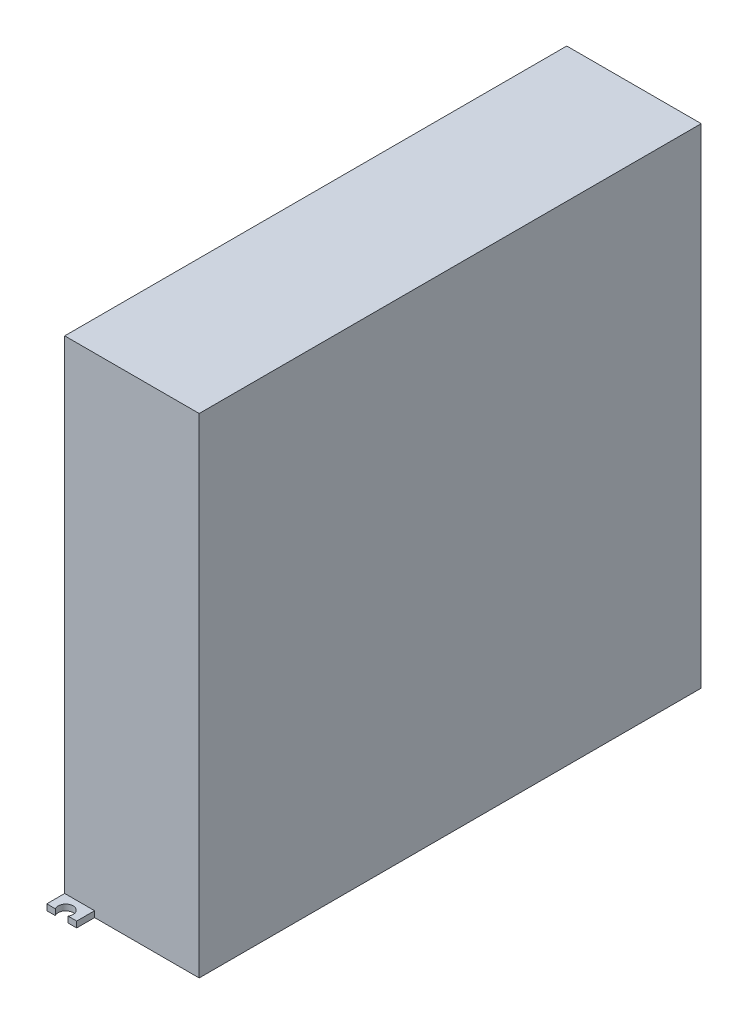
ISO-10303-21;
HEADER;
FILE_DESCRIPTION(('STEP AP214'),'2;1');
FILE_NAME('part.step','',(''),(''),'','','');
FILE_SCHEMA(('AUTOMOTIVE_DESIGN { 1 0 10303 214 1 1 1 1 }'));
ENDSEC;
DATA;
#1=APPLICATION_CONTEXT('core data for automotive mechanical design processes');
#2=APPLICATION_PROTOCOL_DEFINITION('international standard','automotive_design',2000,#1);
#3=PRODUCT_CONTEXT('',#1,'mechanical');
#4=PRODUCT('Part','Part','',(#3));
#5=PRODUCT_RELATED_PRODUCT_CATEGORY('part','',(#4));
#6=PRODUCT_DEFINITION_FORMATION('','',#4);
#7=PRODUCT_DEFINITION_CONTEXT('part definition',#1,'design');
#8=PRODUCT_DEFINITION('design','',#6,#7);
#9=PRODUCT_DEFINITION_SHAPE('','',#8);
#10=(LENGTH_UNIT() NAMED_UNIT(*) SI_UNIT(.MILLI.,.METRE.));
#11=(NAMED_UNIT(*) PLANE_ANGLE_UNIT() SI_UNIT($,.RADIAN.));
#12=(NAMED_UNIT(*) SI_UNIT($,.STERADIAN.) SOLID_ANGLE_UNIT());
#13=UNCERTAINTY_MEASURE_WITH_UNIT(LENGTH_MEASURE(1.E-05),#10,'distance_accuracy_value','');
#14=(GEOMETRIC_REPRESENTATION_CONTEXT(3) GLOBAL_UNCERTAINTY_ASSIGNED_CONTEXT((#13)) GLOBAL_UNIT_ASSIGNED_CONTEXT((#10,
#11,#12)) REPRESENTATION_CONTEXT('',''));
#15=CARTESIAN_POINT('',(0.,0.,0.));
#16=DIRECTION('',(0.,0.,1.));
#17=DIRECTION('',(1.,0.,0.));
#18=AXIS2_PLACEMENT_3D('',#15,#16,#17);
#19=CARTESIAN_POINT('',(0.,2.,174.));
#20=DIRECTION('',(0.,0.,1.));
#21=DIRECTION('',(1.,0.,0.));
#22=AXIS2_PLACEMENT_3D('',#19,#20,#21);
#23=PLANE('',#22);
#24=DIRECTION('',(0.,-1.,0.));
#25=VECTOR('',#24,1.);
#26=CARTESIAN_POINT('',(7.12165179648103,0.,174.));
#27=LINE('',#26,#25);
#28=CARTESIAN_POINT('',(7.12165179648104,0.0209774907794294,174.));
#29=VERTEX_POINT('',#28);
#30=CARTESIAN_POINT('',(7.12165179648103,2.,174.));
#31=VERTEX_POINT('',#30);
#32=EDGE_CURVE('E11',#29,#31,#27,.F.);
#33=ORIENTED_EDGE('',*,*,#32,.F.);
#34=CARTESIAN_POINT('',(10.5552261417755,-2.67290198077238,174.));
#35=CARTESIAN_POINT('',(10.4252272117758,-2.5667904441189,174.));
#36=CARTESIAN_POINT('',(10.2951354911997,-2.46079224657259,174.));
#37=CARTESIAN_POINT('',(10.0347083469683,-2.24909284339983,174.));
#38=CARTESIAN_POINT('',(9.90437292070766,-2.14339164097902,174.));
#39=CARTESIAN_POINT('',(9.64333961160713,-1.93230753844873,174.));
#40=CARTESIAN_POINT('',(9.5126415833817,-1.8269248180296,174.));
#41=CARTESIAN_POINT('',(9.25086470512443,-1.61663470287384,174.));
#42=CARTESIAN_POINT('',(9.1197858573177,-1.51172730536906,174.));
#43=CARTESIAN_POINT('',(8.85629401035401,-1.30186440652924,174.));
#44=CARTESIAN_POINT('',(8.72387783905919,-1.19691288467479,174.));
#45=CARTESIAN_POINT('',(8.45838007459504,-0.987855192045168,174.));
#46=CARTESIAN_POINT('',(8.32529848530474,-0.883749016351335,174.));
#47=CARTESIAN_POINT('',(8.05825311570482,-0.67673377103116,174.));
#48=CARTESIAN_POINT('',(7.92428953625225,-0.57382444267166,174.));
#49=CARTESIAN_POINT('',(7.65508233299974,-0.369696535439789,174.));
#50=CARTESIAN_POINT('',(7.51983875822405,-0.268477892220888,174.));
#51=CARTESIAN_POINT('',(7.28990134983008,-0.0997658160887914,174.));
#52=CARTESIAN_POINT('',(7.19570665703793,-0.0315934175537622,174.));
#53=CARTESIAN_POINT('',(7.00609149285969,0.103064149299188,174.));
#54=CARTESIAN_POINT('',(6.91067083927878,0.169549062360663,174.));
#55=CARTESIAN_POINT('',(6.71812745140789,0.300117653753453,174.));
#56=CARTESIAN_POINT('',(6.6210039281001,0.364200173348755,174.));
#57=CARTESIAN_POINT('',(6.42445814883,0.488735070948628,174.));
#58=CARTESIAN_POINT('',(6.32503656071694,0.549188485697892,174.));
#59=CARTESIAN_POINT('',(6.16568877101694,0.640002278461642,174.));
#60=CARTESIAN_POINT('',(6.10685475513554,0.672270739793827,174.));
#61=CARTESIAN_POINT('',(5.98786594588955,0.734264996376863,174.));
#62=CARTESIAN_POINT('',(5.92771145992594,0.76399137569006,174.));
#63=CARTESIAN_POINT('',(5.80589347383142,0.820027494871496,174.));
#64=CARTESIAN_POINT('',(5.74423168349132,0.846340910264383,174.));
#65=CARTESIAN_POINT('',(5.61915339455988,0.894428629931202,174.));
#66=CARTESIAN_POINT('',(5.55573770675432,0.916204993125566,174.));
#67=CARTESIAN_POINT('',(5.44511309196672,0.948540325305285,174.));
#68=CARTESIAN_POINT('',(5.39832609673766,0.960533496370555,174.));
#69=CARTESIAN_POINT('',(5.30396797029418,0.980852393511029,174.));
#70=CARTESIAN_POINT('',(5.25639717223527,0.989179638093513,174.));
#71=CARTESIAN_POINT('',(5.16089995057854,1.00166177049172,174.));
#72=CARTESIAN_POINT('',(5.1129757845144,1.00583362390967,174.));
#73=CARTESIAN_POINT('',(5.01694388457051,1.00978672020062,174.));
#74=CARTESIAN_POINT('',(4.96883615479627,1.00956806070139,174.));
#75=CARTESIAN_POINT('',(4.87287786660223,1.00475729911779,174.));
#76=CARTESIAN_POINT('',(4.82502715301268,1.00016822916666,174.));
#77=CARTESIAN_POINT('',(4.72989009122344,0.98692149363303,174.));
#78=CARTESIAN_POINT('',(4.68260389783293,0.978262737152801,174.));
#79=CARTESIAN_POINT('',(4.58860135890327,0.957315692894847,174.));
#80=CARTESIAN_POINT('',(4.54188915440346,0.945009103229031,174.));
#81=CARTESIAN_POINT('',(4.4493986171297,0.917351076734052,174.));
#82=CARTESIAN_POINT('',(4.40362011228103,0.902000206641039,174.));
#83=CARTESIAN_POINT('',(4.27207564447061,0.853818982047751,174.));
#84=CARTESIAN_POINT('',(4.1875119678578,0.817717753379313,174.));
#85=CARTESIAN_POINT('',(4.02120452647289,0.739462646884228,174.));
#86=CARTESIAN_POINT('',(3.93946437544267,0.697301344821698,174.));
#87=CARTESIAN_POINT('',(3.77791224767916,0.608732990259849,174.));
#88=CARTESIAN_POINT('',(3.69810935618469,0.562309531509842,174.));
#89=CARTESIAN_POINT('',(3.54027513498129,0.466654959926658,174.));
#90=CARTESIAN_POINT('',(3.46224296831253,0.417425213873388,174.));
#91=CARTESIAN_POINT('',(3.30630530315826,0.316181117478604,174.));
#92=CARTESIAN_POINT('',(3.22842012684065,0.264135627299528,174.));
#93=CARTESIAN_POINT('',(3.07368279238242,0.158521279368328,174.));
#94=CARTESIAN_POINT('',(2.99683073899716,0.104952268826484,174.));
#95=CARTESIAN_POINT('',(2.76784832582868,-0.0571687839740931,174.));
#96=CARTESIAN_POINT('',(2.61690393934954,-0.167392665219842,174.));
#97=CARTESIAN_POINT('',(2.3350327798177,-0.377081994039548,174.));
#98=CARTESIAN_POINT('',(2.2038809546209,-0.476247878832376,174.));
#99=CARTESIAN_POINT('',(1.94265586632526,-0.675997697046022,174.));
#100=CARTESIAN_POINT('',(1.81258263562643,-0.776581672821701,174.));
#101=CARTESIAN_POINT('',(1.55308962177221,-0.978845022110098,174.));
#102=CARTESIAN_POINT('',(1.42367059526439,-1.08052536393412,174.));
#103=CARTESIAN_POINT('',(1.16541461688171,-1.28462306144489,174.));
#104=CARTESIAN_POINT('',(1.03657766753501,-1.38704042032776,174.));
#105=CARTESIAN_POINT('',(0.662737840698865,-1.68552384381983,174.));
#106=CARTESIAN_POINT('',(0.418312554312423,-1.88231297870572,174.));
#107=CARTESIAN_POINT('',(0.0525627731177986,-2.17830941130251,174.));
#108=CARTESIAN_POINT('',(-0.0691371829845904,-2.27705423994857,174.));
#109=CARTESIAN_POINT('',(-0.312327950156759,-2.47479923860023,174.));
#110=CARTESIAN_POINT('',(-0.433818762824118,-2.57379940664081,174.));
#111=CARTESIAN_POINT('',(-0.555226141775491,-2.67290198077238,174.));
#112=B_SPLINE_CURVE_WITH_KNOTS('',3,(#34,#35,#36,#37,#38,#39,#40,#41,#42,#43,#44,#45,#46,#47,
#48,#49,#50,#51,#52,#53,#54,#55,#56,#57,#58,#59,#60,#61,#62,#63,#64,#65,#66,#67,#68,#69,#70,#71,
#72,#73,#74,#75,#76,#77,#78,#79,#80,#81,#82,#83,#84,#85,#86,#87,#88,#89,#90,#91,#92,#93,#94,#95,
#96,#97,#98,#99,#100,#101,#102,#103,#104,#105,#106,#107,#108,#109,#110,#111),.UNSPECIFIED.,.F.,
.F.,(4,2,2,2,2,2,2,2,2,2,2,2,2,2,2,2,2,2,2,2,2,2,2,2,2,2,2,2,2,2,2,2,2,2,2,2,2,2,4),(0.,
0.503422964028827,1.00685134106492,1.51052441922454,2.01419456033998,2.52108442939646,
3.02797134698476,3.53474656956601,4.04150246041526,4.39031817433377,4.73918634093396,
5.08822066566091,5.43715480078417,5.63841687005615,5.83963257292453,6.04062974873347,
6.24153551212002,6.38631243003613,6.53102932161605,6.67515291200668,6.81927329765791,
6.96329376726834,7.10735286424805,7.25214733356632,7.39691487259388,7.67234899581727,
7.94812347770937,8.22500796210096,8.501758725565,8.78275669993661,9.06378295490012,
9.62443914150388,10.1176970650645,10.6109697523589,11.1047211415359,11.5984746731807,
12.5398630439243,13.0100254491303,13.480184246839),.UNSPECIFIED.);
#113=CARTESIAN_POINT('',(7.15105354315304,0.,174.));
#114=VERTEX_POINT('',#113);
#115=EDGE_CURVE('E43',#114,#29,#112,.T.);
#116=ORIENTED_EDGE('',*,*,#115,.F.);
#117=DIRECTION('',(-1.,0.,0.));
#118=VECTOR('',#117,1.);
#119=CARTESIAN_POINT('',(0.,0.,174.));
#120=LINE('',#119,#118);
#121=CARTESIAN_POINT('',(10.,0.,174.));
#122=VERTEX_POINT('',#121);
#123=EDGE_CURVE('E145',#122,#114,#120,.T.);
#124=ORIENTED_EDGE('',*,*,#123,.F.);
#125=DIRECTION('',(0.,-1.,0.));
#126=VECTOR('',#125,1.);
#127=CARTESIAN_POINT('',(10.,2.,174.));
#128=LINE('',#127,#126);
#129=CARTESIAN_POINT('',(10.,2.,174.));
#130=VERTEX_POINT('',#129);
#131=EDGE_CURVE('E129',#130,#122,#128,.T.);
#132=ORIENTED_EDGE('',*,*,#131,.F.);
#133=DIRECTION('',(-1.,0.,0.));
#134=VECTOR('',#133,1.);
#135=CARTESIAN_POINT('',(0.,2.,174.));
#136=LINE('',#135,#134);
#137=EDGE_CURVE('E128',#130,#31,#136,.T.);
#138=ORIENTED_EDGE('',*,*,#137,.T.);
#139=EDGE_LOOP('',(#33,#116,#124,#132,#138));
#140=FACE_BOUND('',#139,.T.);
#141=ADVANCED_FACE('F35',(#140),#23,.T.);
#142=CARTESIAN_POINT('',(0.,163.6,0.));
#143=DIRECTION('',(1.,0.,0.));
#144=DIRECTION('',(0.,0.,-1.));
#145=AXIS2_PLACEMENT_3D('',#142,#143,#144);
#146=PLANE('',#145);
#147=DIRECTION('',(0.,0.,1.));
#148=VECTOR('',#147,1.);
#149=CARTESIAN_POINT('',(0.,0.,0.));
#150=LINE('',#149,#148);
#151=CARTESIAN_POINT('',(0.,0.,0.));
#152=VERTEX_POINT('',#151);
#153=CARTESIAN_POINT('',(0.,0.,174.));
#154=VERTEX_POINT('',#153);
#155=EDGE_CURVE('E151',#152,#154,#150,.T.);
#156=ORIENTED_EDGE('',*,*,#155,.T.);
#157=DIRECTION('',(0.,-1.,0.));
#158=VECTOR('',#157,1.);
#159=CARTESIAN_POINT('',(0.,2.,174.));
#160=LINE('',#159,#158);
#161=CARTESIAN_POINT('',(0.,2.,174.));
#162=VERTEX_POINT('',#161);
#163=EDGE_CURVE('E148',#162,#154,#160,.T.);
#164=ORIENTED_EDGE('',*,*,#163,.F.);
#165=DIRECTION('',(0.,0.,-1.));
#166=VECTOR('',#165,1.);
#167=CARTESIAN_POINT('',(0.,2.,168.));
#168=LINE('',#167,#166);
#169=CARTESIAN_POINT('',(0.,2.,168.));
#170=VERTEX_POINT('',#169);
#171=EDGE_CURVE('E133',#162,#170,#168,.T.);
#172=ORIENTED_EDGE('',*,*,#171,.T.);
#173=DIRECTION('',(0.,-1.,0.));
#174=VECTOR('',#173,1.);
#175=CARTESIAN_POINT('',(0.,163.6,168.));
#176=LINE('',#175,#174);
#177=CARTESIAN_POINT('',(0.,163.6,168.));
#178=VERTEX_POINT('',#177);
#179=EDGE_CURVE('E180',#178,#170,#176,.T.);
#180=ORIENTED_EDGE('',*,*,#179,.F.);
#181=DIRECTION('',(0.,0.,1.));
#182=VECTOR('',#181,1.);
#183=CARTESIAN_POINT('',(0.,163.6,0.));
#184=LINE('',#183,#182);
#185=CARTESIAN_POINT('',(0.,163.6,0.));
#186=VERTEX_POINT('',#185);
#187=EDGE_CURVE('E154',#186,#178,#184,.T.);
#188=ORIENTED_EDGE('',*,*,#187,.F.);
#189=DIRECTION('',(0.,-1.,0.));
#190=VECTOR('',#189,1.);
#191=CARTESIAN_POINT('',(0.,163.6,0.));
#192=LINE('',#191,#190);
#193=EDGE_CURVE('E164',#186,#152,#192,.T.);
#194=ORIENTED_EDGE('',*,*,#193,.T.);
#195=EDGE_LOOP('',(#156,#164,#172,#180,#188,#194));
#196=FACE_BOUND('',#195,.T.);
#197=ADVANCED_FACE('F37',(#196),#146,.F.);
#198=CARTESIAN_POINT('',(0.,163.6,168.));
#199=DIRECTION('',(0.,0.,-1.));
#200=DIRECTION('',(-1.,0.,0.));
#201=AXIS2_PLACEMENT_3D('',#198,#199,#200);
#202=PLANE('',#201);
#203=ORIENTED_EDGE('',*,*,#179,.T.);
#204=DIRECTION('',(1.,0.,0.));
#205=VECTOR('',#204,1.);
#206=CARTESIAN_POINT('',(0.,2.,168.));
#207=LINE('',#206,#205);
#208=CARTESIAN_POINT('',(10.,2.,168.));
#209=VERTEX_POINT('',#208);
#210=EDGE_CURVE('E147',#170,#209,#207,.T.);
#211=ORIENTED_EDGE('',*,*,#210,.T.);
#212=DIRECTION('',(0.,-1.,0.));
#213=VECTOR('',#212,1.);
#214=CARTESIAN_POINT('',(10.,2.,168.));
#215=LINE('',#214,#213);
#216=CARTESIAN_POINT('',(10.,0.,168.));
#217=VERTEX_POINT('',#216);
#218=EDGE_CURVE('E137',#209,#217,#215,.T.);
#219=ORIENTED_EDGE('',*,*,#218,.T.);
#220=DIRECTION('',(1.,0.,0.));
#221=VECTOR('',#220,1.);
#222=CARTESIAN_POINT('',(0.,0.,168.));
#223=LINE('',#222,#221);
#224=CARTESIAN_POINT('',(45.,0.,168.));
#225=VERTEX_POINT('',#224);
#226=EDGE_CURVE('E167',#217,#225,#223,.T.);
#227=ORIENTED_EDGE('',*,*,#226,.T.);
#228=DIRECTION('',(0.,-1.,0.));
#229=VECTOR('',#228,1.);
#230=CARTESIAN_POINT('',(45.,163.6,168.));
#231=LINE('',#230,#229);
#232=CARTESIAN_POINT('',(45.,163.6,168.));
#233=VERTEX_POINT('',#232);
#234=EDGE_CURVE('E177',#233,#225,#231,.T.);
#235=ORIENTED_EDGE('',*,*,#234,.F.);
#236=DIRECTION('',(1.,0.,0.));
#237=VECTOR('',#236,1.);
#238=CARTESIAN_POINT('',(0.,163.6,168.));
#239=LINE('',#238,#237);
#240=EDGE_CURVE('E157',#178,#233,#239,.T.);
#241=ORIENTED_EDGE('',*,*,#240,.F.);
#242=EDGE_LOOP('',(#203,#211,#219,#227,#235,#241));
#243=FACE_BOUND('',#242,.T.);
#244=ADVANCED_FACE('F206',(#243),#202,.F.);
#245=CARTESIAN_POINT('',(45.,163.6,0.));
#246=DIRECTION('',(-1.,0.,0.));
#247=DIRECTION('',(0.,0.,1.));
#248=AXIS2_PLACEMENT_3D('',#245,#246,#247);
#249=PLANE('',#248);
#250=DIRECTION('',(0.,0.,-1.));
#251=VECTOR('',#250,1.);
#252=CARTESIAN_POINT('',(45.,0.,0.));
#253=LINE('',#252,#251);
#254=CARTESIAN_POINT('',(45.,0.,0.));
#255=VERTEX_POINT('',#254);
#256=EDGE_CURVE('E169',#225,#255,#253,.T.);
#257=ORIENTED_EDGE('',*,*,#256,.T.);
#258=DIRECTION('',(0.,-1.,0.));
#259=VECTOR('',#258,1.);
#260=CARTESIAN_POINT('',(45.,163.6,0.));
#261=LINE('',#260,#259);
#262=CARTESIAN_POINT('',(45.,163.6,0.));
#263=VERTEX_POINT('',#262);
#264=EDGE_CURVE('E174',#263,#255,#261,.T.);
#265=ORIENTED_EDGE('',*,*,#264,.F.);
#266=DIRECTION('',(0.,0.,-1.));
#267=VECTOR('',#266,1.);
#268=CARTESIAN_POINT('',(45.,163.6,0.));
#269=LINE('',#268,#267);
#270=EDGE_CURVE('E160',#233,#263,#269,.T.);
#271=ORIENTED_EDGE('',*,*,#270,.F.);
#272=ORIENTED_EDGE('',*,*,#234,.T.);
#273=EDGE_LOOP('',(#257,#265,#271,#272));
#274=FACE_BOUND('',#273,.T.);
#275=ADVANCED_FACE('F239',(#274),#249,.F.);
#276=CARTESIAN_POINT('',(0.,163.6,0.));
#277=DIRECTION('',(0.,0.,1.));
#278=DIRECTION('',(1.,0.,0.));
#279=AXIS2_PLACEMENT_3D('',#276,#277,#278);
#280=PLANE('',#279);
#281=DIRECTION('',(-1.,0.,0.));
#282=VECTOR('',#281,1.);
#283=CARTESIAN_POINT('',(0.,0.,0.));
#284=LINE('',#283,#282);
#285=EDGE_CURVE('E158',#255,#152,#284,.T.);
#286=ORIENTED_EDGE('',*,*,#285,.T.);
#287=ORIENTED_EDGE('',*,*,#193,.F.);
#288=DIRECTION('',(-1.,0.,0.));
#289=VECTOR('',#288,1.);
#290=CARTESIAN_POINT('',(0.,163.6,0.));
#291=LINE('',#290,#289);
#292=EDGE_CURVE('E162',#263,#186,#291,.T.);
#293=ORIENTED_EDGE('',*,*,#292,.F.);
#294=ORIENTED_EDGE('',*,*,#264,.T.);
#295=EDGE_LOOP('',(#286,#287,#293,#294));
#296=FACE_BOUND('',#295,.T.);
#297=ADVANCED_FACE('F240',(#296),#280,.F.);
#298=CARTESIAN_POINT('',(0.,163.6,0.));
#299=DIRECTION('',(0.,1.,0.));
#300=DIRECTION('',(0.,0.,1.));
#301=AXIS2_PLACEMENT_3D('',#298,#299,#300);
#302=PLANE('',#301);
#303=ORIENTED_EDGE('',*,*,#187,.T.);
#304=ORIENTED_EDGE('',*,*,#240,.T.);
#305=ORIENTED_EDGE('',*,*,#270,.T.);
#306=ORIENTED_EDGE('',*,*,#292,.T.);
#307=EDGE_LOOP('',(#303,#304,#305,#306));
#308=FACE_BOUND('',#307,.T.);
#309=ADVANCED_FACE('F214',(#308),#302,.T.);
#310=CARTESIAN_POINT('',(0.,0.,0.));
#311=DIRECTION('',(0.,1.,0.));
#312=DIRECTION('',(0.,0.,1.));
#313=AXIS2_PLACEMENT_3D('',#310,#311,#312);
#314=PLANE('',#313);
#315=ORIENTED_EDGE('',*,*,#123,.T.);
#316=CARTESIAN_POINT('',(5.00000000000002,0.,172.677655999942));
#317=DIRECTION('',(0.,-1.,0.));
#318=DIRECTION('',(0.,0.,-1.));
#319=AXIS2_PLACEMENT_3D('',#316,#317,#318);
#320=CIRCLE('',#319,2.525);
#321=CARTESIAN_POINT('',(2.848946456847,0.,174.));
#322=VERTEX_POINT('',#321);
#323=EDGE_CURVE('E111',#322,#114,#320,.T.);
#324=ORIENTED_EDGE('',*,*,#323,.F.);
#325=EDGE_CURVE('E144',#322,#154,#120,.T.);
#326=ORIENTED_EDGE('',*,*,#325,.T.);
#327=ORIENTED_EDGE('',*,*,#155,.F.);
#328=ORIENTED_EDGE('',*,*,#285,.F.);
#329=ORIENTED_EDGE('',*,*,#256,.F.);
#330=ORIENTED_EDGE('',*,*,#226,.F.);
#331=DIRECTION('',(0.,0.,1.));
#332=VECTOR('',#331,1.);
#333=CARTESIAN_POINT('',(10.,0.,174.));
#334=LINE('',#333,#332);
#335=EDGE_CURVE('E58',#217,#122,#334,.T.);
#336=ORIENTED_EDGE('',*,*,#335,.T.);
#337=EDGE_LOOP('',(#315,#324,#326,#327,#328,#329,#330,#336));
#338=FACE_BOUND('',#337,.T.);
#339=ADVANCED_FACE('F209',(#338),#314,.F.);
#340=DIRECTION('',(0.,-1.,0.));
#341=VECTOR('',#340,1.);
#342=CARTESIAN_POINT('',(2.87834820351901,0.,174.));
#343=LINE('',#342,#341);
#344=CARTESIAN_POINT('',(2.87834820351901,2.,174.));
#345=VERTEX_POINT('',#344);
#346=CARTESIAN_POINT('',(2.87834820351896,0.02097749077942,174.));
#347=VERTEX_POINT('',#346);
#348=EDGE_CURVE('E116',#345,#347,#343,.T.);
#349=ORIENTED_EDGE('',*,*,#348,.F.);
#350=EDGE_CURVE('E134',#345,#162,#136,.T.);
#351=ORIENTED_EDGE('',*,*,#350,.T.);
#352=ORIENTED_EDGE('',*,*,#163,.T.);
#353=ORIENTED_EDGE('',*,*,#325,.F.);
#354=EDGE_CURVE('E118',#347,#322,#112,.T.);
#355=ORIENTED_EDGE('',*,*,#354,.F.);
#356=EDGE_LOOP('',(#349,#351,#352,#353,#355));
#357=FACE_BOUND('',#356,.T.);
#358=ADVANCED_FACE('F188',(#357),#23,.T.);
#359=CARTESIAN_POINT('',(10.,2.,174.));
#360=DIRECTION('',(1.,0.,0.));
#361=DIRECTION('',(0.,0.,-1.));
#362=AXIS2_PLACEMENT_3D('',#359,#360,#361);
#363=PLANE('',#362);
#364=ORIENTED_EDGE('',*,*,#335,.F.);
#365=ORIENTED_EDGE('',*,*,#218,.F.);
#366=DIRECTION('',(0.,0.,1.));
#367=VECTOR('',#366,1.);
#368=CARTESIAN_POINT('',(10.,2.,174.));
#369=LINE('',#368,#367);
#370=EDGE_CURVE('E139',#209,#130,#369,.T.);
#371=ORIENTED_EDGE('',*,*,#370,.T.);
#372=ORIENTED_EDGE('',*,*,#131,.T.);
#373=EDGE_LOOP('',(#364,#365,#371,#372));
#374=FACE_BOUND('',#373,.T.);
#375=ADVANCED_FACE('F198',(#374),#363,.T.);
#376=CARTESIAN_POINT('',(0.,2.,0.));
#377=DIRECTION('',(0.,1.,0.));
#378=DIRECTION('',(0.,0.,1.));
#379=AXIS2_PLACEMENT_3D('',#376,#377,#378);
#380=PLANE('',#379);
#381=CARTESIAN_POINT('',(5.00000000000002,2.,172.677655999942));
#382=DIRECTION('',(0.,1.,0.));
#383=DIRECTION('',(0.,0.,1.));
#384=AXIS2_PLACEMENT_3D('',#381,#382,#383);
#385=CIRCLE('',#384,2.49999999999999);
#386=EDGE_CURVE('E124',#31,#345,#385,.T.);
#387=ORIENTED_EDGE('',*,*,#386,.F.);
#388=ORIENTED_EDGE('',*,*,#137,.F.);
#389=ORIENTED_EDGE('',*,*,#370,.F.);
#390=ORIENTED_EDGE('',*,*,#210,.F.);
#391=ORIENTED_EDGE('',*,*,#171,.F.);
#392=ORIENTED_EDGE('',*,*,#350,.F.);
#393=EDGE_LOOP('',(#387,#388,#389,#390,#391,#392));
#394=FACE_BOUND('',#393,.T.);
#395=ADVANCED_FACE('F196',(#394),#380,.T.);
#396=CARTESIAN_POINT('',(5.00000000000002,0.,172.677655999942));
#397=DIRECTION('',(0.,-1.,0.));
#398=DIRECTION('',(0.,0.,-1.));
#399=AXIS2_PLACEMENT_3D('',#396,#397,#398);
#400=CYLINDRICAL_SURFACE('',#399,2.49999999999999);
#401=ORIENTED_EDGE('',*,*,#348,.T.);
#402=CARTESIAN_POINT('',(5.00000000000002,0.0209774907794294,172.677655999942));
#403=DIRECTION('',(0.,-1.,0.));
#404=DIRECTION('',(0.,0.,-1.));
#405=AXIS2_PLACEMENT_3D('',#402,#403,#404);
#406=CIRCLE('',#405,2.5);
#407=EDGE_CURVE('E50',#347,#29,#406,.T.);
#408=ORIENTED_EDGE('',*,*,#407,.T.);
#409=ORIENTED_EDGE('',*,*,#32,.T.);
#410=ORIENTED_EDGE('',*,*,#386,.T.);
#411=EDGE_LOOP('',(#401,#408,#409,#410));
#412=FACE_BOUND('',#411,.T.);
#413=ADVANCED_FACE('F120',(#412),#400,.F.);
#414=CARTESIAN_POINT('',(5.00000000000002,0.,172.677655999942));
#415=DIRECTION('',(0.,-1.,0.));
#416=DIRECTION('',(0.,0.,-1.));
#417=AXIS2_PLACEMENT_3D('',#414,#415,#416);
#418=CONICAL_SURFACE('',#417,2.525,0.872664625997257);
#419=ORIENTED_EDGE('',*,*,#115,.T.);
#420=ORIENTED_EDGE('',*,*,#407,.F.);
#421=ORIENTED_EDGE('',*,*,#354,.T.);
#422=ORIENTED_EDGE('',*,*,#323,.T.);
#423=EDGE_LOOP('',(#419,#420,#421,#422));
#424=FACE_BOUND('',#423,.T.);
#425=ADVANCED_FACE('F109',(#424),#418,.F.);
#426=CLOSED_SHELL('',(#141,#197,#244,#275,#297,#309,#339,#358,#375,#395,#413,#425));
#427=MANIFOLD_SOLID_BREP('B2',#426);
#428=ADVANCED_BREP_SHAPE_REPRESENTATION('',(#18,#427),#14);
#429=SHAPE_DEFINITION_REPRESENTATION(#9,#428);
ENDSEC;
END-ISO-10303-21;
